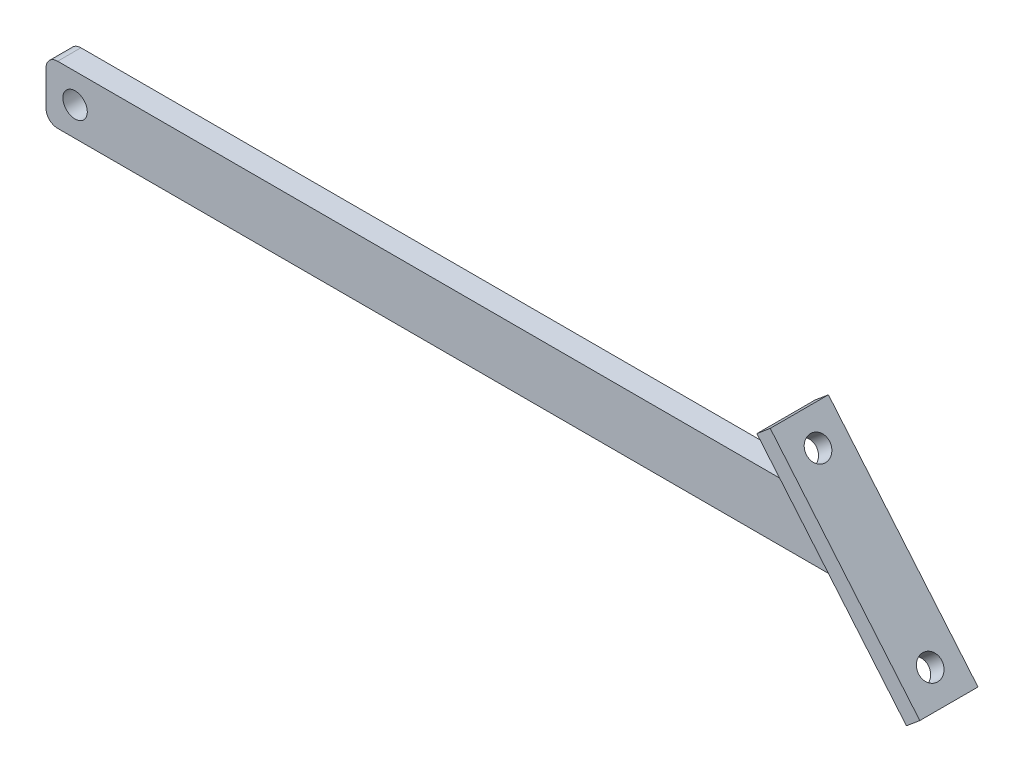
ISO-10303-21;
HEADER;
FILE_DESCRIPTION(('STEP AP214'),'2;1');
FILE_NAME('part.step','',(''),(''),'','','');
FILE_SCHEMA(('AUTOMOTIVE_DESIGN { 1 0 10303 214 1 1 1 1 }'));
ENDSEC;
DATA;
#1=APPLICATION_CONTEXT('core data for automotive mechanical design processes');
#2=APPLICATION_PROTOCOL_DEFINITION('international standard','automotive_design',2000,#1);
#3=PRODUCT_CONTEXT('',#1,'mechanical');
#4=PRODUCT('Part','Part','',(#3));
#5=PRODUCT_RELATED_PRODUCT_CATEGORY('part','',(#4));
#6=PRODUCT_DEFINITION_FORMATION('','',#4);
#7=PRODUCT_DEFINITION_CONTEXT('part definition',#1,'design');
#8=PRODUCT_DEFINITION('design','',#6,#7);
#9=PRODUCT_DEFINITION_SHAPE('','',#8);
#10=(LENGTH_UNIT() NAMED_UNIT(*) SI_UNIT(.MILLI.,.METRE.));
#11=(NAMED_UNIT(*) PLANE_ANGLE_UNIT() SI_UNIT($,.RADIAN.));
#12=(NAMED_UNIT(*) SI_UNIT($,.STERADIAN.) SOLID_ANGLE_UNIT());
#13=UNCERTAINTY_MEASURE_WITH_UNIT(LENGTH_MEASURE(1.E-05),#10,'distance_accuracy_value','');
#14=(GEOMETRIC_REPRESENTATION_CONTEXT(3) GLOBAL_UNCERTAINTY_ASSIGNED_CONTEXT((#13)) GLOBAL_UNIT_ASSIGNED_CONTEXT((#10,
#11,#12)) REPRESENTATION_CONTEXT('',''));
#15=CARTESIAN_POINT('',(0.,0.,0.));
#16=DIRECTION('',(0.,0.,1.));
#17=DIRECTION('',(1.,0.,0.));
#18=AXIS2_PLACEMENT_3D('',#15,#16,#17);
#19=CARTESIAN_POINT('',(73.4224118824471,61.6087187307084,0.));
#20=DIRECTION('',(0.766044443118975,0.642787609686544,0.));
#21=DIRECTION('',(-0.642787609686544,0.766044443118975,0.));
#22=AXIS2_PLACEMENT_3D('',#19,#20,#21);
#23=PLANE('',#22);
#24=CARTESIAN_POINT('',(115.858944825505,11.0348281385772,2.));
#25=DIRECTION('',(0.766044443118974,0.642787609686544,0.));
#26=DIRECTION('',(-0.642787609686544,0.766044443118974,0.));
#27=AXIS2_PLACEMENT_3D('',#24,#25,#26);
#28=CIRCLE('',#27,2.);
#29=CARTESIAN_POINT('',(114.573369606132,12.5669170248151,2.));
#30=VERTEX_POINT('',#29);
#31=EDGE_CURVE('E112',#30,#30,#28,.T.);
#32=ORIENTED_EDGE('',*,*,#31,.F.);
#33=EDGE_LOOP('',(#32));
#34=FACE_BOUND('',#33,.T.);
#35=DIRECTION('',(-0.642787609686544,0.766044443118975,0.));
#36=VECTOR('',#35,1.);
#37=CARTESIAN_POINT('',(112.645006777072,14.865050354172,-3.));
#38=LINE('',#37,#36);
#39=CARTESIAN_POINT('',(138.356511164534,-15.776727370587,-3.));
#40=VERTEX_POINT('',#39);
#41=CARTESIAN_POINT('',(112.645006777072,14.865050354172,-3.));
#42=VERTEX_POINT('',#41);
#43=EDGE_CURVE('E97',#40,#42,#38,.T.);
#44=ORIENTED_EDGE('',*,*,#43,.T.);
#45=DIRECTION('',(0.,0.,1.));
#46=VECTOR('',#45,1.);
#47=CARTESIAN_POINT('',(112.645006777072,14.865050354172,7.));
#48=LINE('',#47,#46);
#49=CARTESIAN_POINT('',(112.645006777072,14.865050354172,7.));
#50=VERTEX_POINT('',#49);
#51=EDGE_CURVE('E92',#42,#50,#48,.T.);
#52=ORIENTED_EDGE('',*,*,#51,.T.);
#53=DIRECTION('',(0.642787609686544,-0.766044443118974,0.));
#54=VECTOR('',#53,1.);
#55=CARTESIAN_POINT('',(138.356511164534,-15.776727370587,7.));
#56=LINE('',#55,#54);
#57=CARTESIAN_POINT('',(138.356511164534,-15.776727370587,7.));
#58=VERTEX_POINT('',#57);
#59=EDGE_CURVE('E95',#50,#58,#56,.T.);
#60=ORIENTED_EDGE('',*,*,#59,.T.);
#61=DIRECTION('',(0.,0.,-1.));
#62=VECTOR('',#61,1.);
#63=CARTESIAN_POINT('',(138.356511164534,-15.776727370587,7.));
#64=LINE('',#63,#62);
#65=EDGE_CURVE('E62',#58,#40,#64,.T.);
#66=ORIENTED_EDGE('',*,*,#65,.T.);
#67=EDGE_LOOP('',(#44,#52,#60,#66));
#68=FACE_BOUND('',#67,.T.);
#69=CARTESIAN_POINT('',(135.142573116101,-11.9465051549921,2.00000000000001));
#70=DIRECTION('',(0.766044443118974,0.642787609686544,0.));
#71=DIRECTION('',(-0.642787609686544,0.766044443118974,0.));
#72=AXIS2_PLACEMENT_3D('',#69,#70,#71);
#73=CIRCLE('',#72,2.);
#74=CARTESIAN_POINT('',(133.856997896728,-10.4144162687541,2.00000000000001));
#75=VERTEX_POINT('',#74);
#76=EDGE_CURVE('E127',#75,#75,#73,.T.);
#77=ORIENTED_EDGE('',*,*,#76,.F.);
#78=EDGE_LOOP('',(#77));
#79=FACE_BOUND('',#78,.T.);
#80=ADVANCED_FACE('F45',(#34,#68,#79),#23,.T.);
#81=CARTESIAN_POINT('',(71.1242785530901,59.6803559016487,0.));
#82=DIRECTION('',(0.766044443118975,0.642787609686544,0.));
#83=DIRECTION('',(-0.642787609686544,0.766044443118975,0.));
#84=AXIS2_PLACEMENT_3D('',#81,#82,#83);
#85=PLANE('',#84);
#86=DIRECTION('',(-0.642787609686544,0.766044443118975,0.));
#87=VECTOR('',#86,1.);
#88=CARTESIAN_POINT('',(110.346873447715,12.9366875251124,-3.));
#89=LINE('',#88,#87);
#90=CARTESIAN_POINT('',(136.058377835177,-17.7050901996466,-3.));
#91=VERTEX_POINT('',#90);
#92=CARTESIAN_POINT('',(110.346873447715,12.9366875251124,-3.));
#93=VERTEX_POINT('',#92);
#94=EDGE_CURVE('E109',#91,#93,#89,.T.);
#95=ORIENTED_EDGE('',*,*,#94,.F.);
#96=DIRECTION('',(0.,0.,-1.));
#97=VECTOR('',#96,1.);
#98=CARTESIAN_POINT('',(136.058377835177,-17.7050901996466,7.));
#99=LINE('',#98,#97);
#100=CARTESIAN_POINT('',(136.058377835177,-17.7050901996466,7.));
#101=VERTEX_POINT('',#100);
#102=EDGE_CURVE('E85',#101,#91,#99,.T.);
#103=ORIENTED_EDGE('',*,*,#102,.F.);
#104=DIRECTION('',(0.642787609686544,-0.766044443118974,0.));
#105=VECTOR('',#104,1.);
#106=CARTESIAN_POINT('',(136.058377835177,-17.7050901996466,7.));
#107=LINE('',#106,#105);
#108=CARTESIAN_POINT('',(110.346873447715,12.9366875251124,7.));
#109=VERTEX_POINT('',#108);
#110=EDGE_CURVE('E79',#109,#101,#107,.T.);
#111=ORIENTED_EDGE('',*,*,#110,.F.);
#112=DIRECTION('',(0.,0.,1.));
#113=VECTOR('',#112,1.);
#114=CARTESIAN_POINT('',(110.346873447715,12.9366875251124,7.));
#115=LINE('',#114,#113);
#116=EDGE_CURVE('E101',#93,#109,#115,.T.);
#117=ORIENTED_EDGE('',*,*,#116,.F.);
#118=EDGE_LOOP('',(#95,#103,#111,#117));
#119=FACE_BOUND('',#118,.T.);
#120=CARTESIAN_POINT('',(113.560811496148,9.10646530951752,2.));
#121=DIRECTION('',(0.766044443118974,0.642787609686544,0.));
#122=DIRECTION('',(-0.642787609686544,0.766044443118974,0.));
#123=AXIS2_PLACEMENT_3D('',#120,#121,#122);
#124=CIRCLE('',#123,2.);
#125=CARTESIAN_POINT('',(112.275236276775,10.6385541957555,2.));
#126=VERTEX_POINT('',#125);
#127=EDGE_CURVE('E124',#126,#126,#124,.T.);
#128=ORIENTED_EDGE('',*,*,#127,.T.);
#129=EDGE_LOOP('',(#128));
#130=FACE_BOUND('',#129,.T.);
#131=CARTESIAN_POINT('',(132.844439786744,-13.8748679840517,2.00000000000001));
#132=DIRECTION('',(0.766044443118974,0.642787609686544,0.));
#133=DIRECTION('',(-0.642787609686544,0.766044443118974,0.));
#134=AXIS2_PLACEMENT_3D('',#131,#132,#133);
#135=CIRCLE('',#134,2.);
#136=CARTESIAN_POINT('',(131.558864567371,-12.3427790978138,2.00000000000001));
#137=VERTEX_POINT('',#136);
#138=EDGE_CURVE('E130',#137,#137,#135,.T.);
#139=ORIENTED_EDGE('',*,*,#138,.T.);
#140=EDGE_LOOP('',(#139));
#141=FACE_BOUND('',#140,.T.);
#142=ADVANCED_FACE('F120',(#119,#130,#141),#85,.F.);
#143=CARTESIAN_POINT('',(112.645006777072,14.865050354172,-3.));
#144=DIRECTION('',(0.,0.,1.));
#145=DIRECTION('',(0.,-1.,0.));
#146=AXIS2_PLACEMENT_3D('',#143,#144,#145);
#147=PLANE('',#146);
#148=ORIENTED_EDGE('',*,*,#94,.T.);
#149=DIRECTION('',(-0.766044443118974,-0.642787609686544,0.));
#150=VECTOR('',#149,1.);
#151=CARTESIAN_POINT('',(112.645006777072,14.865050354172,-3.));
#152=LINE('',#151,#150);
#153=EDGE_CURVE('E12',#42,#93,#152,.T.);
#154=ORIENTED_EDGE('',*,*,#153,.F.);
#155=ORIENTED_EDGE('',*,*,#43,.F.);
#156=DIRECTION('',(-0.766044443118974,-0.642787609686544,0.));
#157=VECTOR('',#156,1.);
#158=CARTESIAN_POINT('',(138.356511164534,-15.776727370587,-3.));
#159=LINE('',#158,#157);
#160=EDGE_CURVE('E105',#40,#91,#159,.T.);
#161=ORIENTED_EDGE('',*,*,#160,.T.);
#162=EDGE_LOOP('',(#148,#154,#155,#161));
#163=FACE_BOUND('',#162,.T.);
#164=ADVANCED_FACE('F47',(#163),#147,.F.);
#165=CARTESIAN_POINT('',(112.645006777072,14.865050354172,7.));
#166=DIRECTION('',(0.642787609686544,-0.766044443118974,0.));
#167=DIRECTION('',(0.766044443118975,0.642787609686544,0.));
#168=AXIS2_PLACEMENT_3D('',#165,#166,#167);
#169=PLANE('',#168);
#170=ORIENTED_EDGE('',*,*,#116,.T.);
#171=DIRECTION('',(-0.766044443118974,-0.642787609686544,0.));
#172=VECTOR('',#171,1.);
#173=CARTESIAN_POINT('',(112.645006777072,14.865050354172,7.));
#174=LINE('',#173,#172);
#175=EDGE_CURVE('E54',#50,#109,#174,.T.);
#176=ORIENTED_EDGE('',*,*,#175,.F.);
#177=ORIENTED_EDGE('',*,*,#51,.F.);
#178=ORIENTED_EDGE('',*,*,#153,.T.);
#179=EDGE_LOOP('',(#170,#176,#177,#178));
#180=FACE_BOUND('',#179,.T.);
#181=ADVANCED_FACE('F100',(#180),#169,.F.);
#182=CARTESIAN_POINT('',(138.356511164534,-15.776727370587,7.));
#183=DIRECTION('',(0.,0.,-1.));
#184=DIRECTION('',(-1.,0.,0.));
#185=AXIS2_PLACEMENT_3D('',#182,#183,#184);
#186=PLANE('',#185);
#187=ORIENTED_EDGE('',*,*,#110,.T.);
#188=DIRECTION('',(-0.766044443118974,-0.642787609686544,0.));
#189=VECTOR('',#188,1.);
#190=CARTESIAN_POINT('',(138.356511164534,-15.776727370587,7.));
#191=LINE('',#190,#189);
#192=EDGE_CURVE('E102',#58,#101,#191,.T.);
#193=ORIENTED_EDGE('',*,*,#192,.F.);
#194=ORIENTED_EDGE('',*,*,#59,.F.);
#195=ORIENTED_EDGE('',*,*,#175,.T.);
#196=EDGE_LOOP('',(#187,#193,#194,#195));
#197=FACE_BOUND('',#196,.T.);
#198=ADVANCED_FACE('F103',(#197),#186,.F.);
#199=CARTESIAN_POINT('',(138.356511164534,-15.776727370587,7.));
#200=DIRECTION('',(-0.642787609686544,0.766044443118974,0.));
#201=DIRECTION('',(-0.766044443118975,-0.642787609686544,0.));
#202=AXIS2_PLACEMENT_3D('',#199,#200,#201);
#203=PLANE('',#202);
#204=ORIENTED_EDGE('',*,*,#102,.T.);
#205=ORIENTED_EDGE('',*,*,#160,.F.);
#206=ORIENTED_EDGE('',*,*,#65,.F.);
#207=ORIENTED_EDGE('',*,*,#192,.T.);
#208=EDGE_LOOP('',(#204,#205,#206,#207));
#209=FACE_BOUND('',#208,.T.);
#210=ADVANCED_FACE('F117',(#209),#203,.F.);
#211=CARTESIAN_POINT('',(115.858944825505,11.0348281385772,2.));
#212=DIRECTION('',(-0.766044443118974,-0.642787609686544,0.));
#213=DIRECTION('',(0.642787609686544,-0.766044443118975,0.));
#214=AXIS2_PLACEMENT_3D('',#211,#212,#213);
#215=CYLINDRICAL_SURFACE('',#214,2.);
#216=ORIENTED_EDGE('',*,*,#31,.T.);
#217=EDGE_LOOP('',(#216));
#218=FACE_BOUND('',#217,.T.);
#219=ORIENTED_EDGE('',*,*,#127,.F.);
#220=EDGE_LOOP('',(#219));
#221=FACE_BOUND('',#220,.T.);
#222=ADVANCED_FACE('F147',(#218,#221),#215,.F.);
#223=CARTESIAN_POINT('',(135.142573116101,-11.9465051549921,2.00000000000001));
#224=DIRECTION('',(-0.766044443118974,-0.642787609686544,0.));
#225=DIRECTION('',(0.642787609686544,-0.766044443118975,0.));
#226=AXIS2_PLACEMENT_3D('',#223,#224,#225);
#227=CYLINDRICAL_SURFACE('',#226,2.);
#228=ORIENTED_EDGE('',*,*,#76,.T.);
#229=EDGE_LOOP('',(#228));
#230=FACE_BOUND('',#229,.T.);
#231=ORIENTED_EDGE('',*,*,#138,.F.);
#232=EDGE_LOOP('',(#231));
#233=FACE_BOUND('',#232,.T.);
#234=ADVANCED_FACE('F136',(#230,#233),#227,.F.);
#235=CLOSED_SHELL('',(#80,#142,#164,#181,#198,#210,#222,#234));
#236=MANIFOLD_SOLID_BREP('B2',#235);
#237=CARTESIAN_POINT('',(0.,0.,4.));
#238=DIRECTION('',(0.,0.,1.));
#239=DIRECTION('',(1.,0.,0.));
#240=AXIS2_PLACEMENT_3D('',#237,#238,#239);
#241=PLANE('',#240);
#242=DIRECTION('',(0.,-1.,0.));
#243=VECTOR('',#242,1.);
#244=CARTESIAN_POINT('',(-14.8342541436464,5.27624309392265,4.));
#245=LINE('',#244,#243);
#246=CARTESIAN_POINT('',(-14.8342541436464,3.27624309392265,4.));
#247=VERTEX_POINT('',#246);
#248=CARTESIAN_POINT('',(-14.8342541436464,-2.72375690607735,4.));
#249=VERTEX_POINT('',#248);
#250=EDGE_CURVE('E275',#247,#249,#245,.T.);
#251=ORIENTED_EDGE('',*,*,#250,.T.);
#252=CARTESIAN_POINT('',(-12.8342541436464,-2.72375690607735,4.));
#253=DIRECTION('',(0.,0.,1.));
#254=DIRECTION('',(1.,0.,0.));
#255=AXIS2_PLACEMENT_3D('',#252,#253,#254);
#256=CIRCLE('',#255,2.);
#257=CARTESIAN_POINT('',(-12.8342541436464,-4.72375690607735,4.));
#258=VERTEX_POINT('',#257);
#259=EDGE_CURVE('E219',#249,#258,#256,.T.);
#260=ORIENTED_EDGE('',*,*,#259,.T.);
#261=DIRECTION('',(1.,0.,0.));
#262=VECTOR('',#261,1.);
#263=CARTESIAN_POINT('',(-14.8342541436464,-4.72375690607735,4.));
#264=LINE('',#263,#262);
#265=CARTESIAN_POINT('',(125.165745856354,-4.72375690607735,4.));
#266=VERTEX_POINT('',#265);
#267=EDGE_CURVE('E265',#258,#266,#264,.T.);
#268=ORIENTED_EDGE('',*,*,#267,.T.);
#269=DIRECTION('',(-0.642787609686544,0.766044443118974,0.));
#270=VECTOR('',#269,1.);
#271=CARTESIAN_POINT('',(125.165745856354,-4.72375690607735,4.));
#272=LINE('',#271,#270);
#273=CARTESIAN_POINT('',(116.774749544581,5.27624309392265,4.));
#274=VERTEX_POINT('',#273);
#275=EDGE_CURVE('E269',#266,#274,#272,.T.);
#276=ORIENTED_EDGE('',*,*,#275,.T.);
#277=DIRECTION('',(-1.,0.,0.));
#278=VECTOR('',#277,1.);
#279=CARTESIAN_POINT('',(-14.8342541436464,5.27624309392265,4.));
#280=LINE('',#279,#278);
#281=CARTESIAN_POINT('',(-12.8342541436464,5.27624309392265,4.));
#282=VERTEX_POINT('',#281);
#283=EDGE_CURVE('E289',#274,#282,#280,.T.);
#284=ORIENTED_EDGE('',*,*,#283,.T.);
#285=CARTESIAN_POINT('',(-12.8342541436464,3.27624309392265,4.));
#286=DIRECTION('',(0.,0.,1.));
#287=DIRECTION('',(1.,0.,0.));
#288=AXIS2_PLACEMENT_3D('',#285,#286,#287);
#289=CIRCLE('',#288,2.);
#290=EDGE_CURVE('E312',#282,#247,#289,.T.);
#291=ORIENTED_EDGE('',*,*,#290,.T.);
#292=EDGE_LOOP('',(#251,#260,#268,#276,#284,#291));
#293=FACE_BOUND('',#292,.T.);
#294=CARTESIAN_POINT('',(-9.8342541436464,0.276243093922653,4.));
#295=DIRECTION('',(0.,0.,1.));
#296=DIRECTION('',(1.,0.,0.));
#297=AXIS2_PLACEMENT_3D('',#294,#295,#296);
#298=CIRCLE('',#297,2.1);
#299=CARTESIAN_POINT('',(-7.7342541436464,0.276243093922653,4.));
#300=VERTEX_POINT('',#299);
#301=EDGE_CURVE('E296',#300,#300,#298,.T.);
#302=ORIENTED_EDGE('',*,*,#301,.F.);
#303=EDGE_LOOP('',(#302));
#304=FACE_BOUND('',#303,.T.);
#305=ADVANCED_FACE('F211',(#293,#304),#241,.T.);
#306=CARTESIAN_POINT('',(0.,0.,0.));
#307=DIRECTION('',(0.,0.,1.));
#308=DIRECTION('',(1.,0.,0.));
#309=AXIS2_PLACEMENT_3D('',#306,#307,#308);
#310=PLANE('',#309);
#311=DIRECTION('',(1.,0.,0.));
#312=VECTOR('',#311,1.);
#313=CARTESIAN_POINT('',(-14.8342541436464,-4.72375690607735,0.));
#314=LINE('',#313,#312);
#315=CARTESIAN_POINT('',(-12.8342541436464,-4.72375690607735,0.));
#316=VERTEX_POINT('',#315);
#317=CARTESIAN_POINT('',(125.165745856354,-4.72375690607735,0.));
#318=VERTEX_POINT('',#317);
#319=EDGE_CURVE('E281',#316,#318,#314,.T.);
#320=ORIENTED_EDGE('',*,*,#319,.F.);
#321=CARTESIAN_POINT('',(-12.8342541436464,-2.72375690607735,0.));
#322=DIRECTION('',(0.,0.,1.));
#323=DIRECTION('',(1.,0.,0.));
#324=AXIS2_PLACEMENT_3D('',#321,#322,#323);
#325=CIRCLE('',#324,2.);
#326=CARTESIAN_POINT('',(-14.8342541436464,-2.72375690607735,0.));
#327=VERTEX_POINT('',#326);
#328=EDGE_CURVE('E306',#316,#327,#325,.F.);
#329=ORIENTED_EDGE('',*,*,#328,.T.);
#330=DIRECTION('',(0.,-1.,0.));
#331=VECTOR('',#330,1.);
#332=CARTESIAN_POINT('',(-14.8342541436464,5.27624309392265,0.));
#333=LINE('',#332,#331);
#334=CARTESIAN_POINT('',(-14.8342541436464,3.27624309392265,0.));
#335=VERTEX_POINT('',#334);
#336=EDGE_CURVE('E294',#335,#327,#333,.T.);
#337=ORIENTED_EDGE('',*,*,#336,.F.);
#338=CARTESIAN_POINT('',(-12.8342541436464,3.27624309392265,0.));
#339=DIRECTION('',(0.,0.,1.));
#340=DIRECTION('',(1.,0.,0.));
#341=AXIS2_PLACEMENT_3D('',#338,#339,#340);
#342=CIRCLE('',#341,2.);
#343=CARTESIAN_POINT('',(-12.8342541436464,5.27624309392265,0.));
#344=VERTEX_POINT('',#343);
#345=EDGE_CURVE('E304',#335,#344,#342,.F.);
#346=ORIENTED_EDGE('',*,*,#345,.T.);
#347=DIRECTION('',(-1.,0.,0.));
#348=VECTOR('',#347,1.);
#349=CARTESIAN_POINT('',(-14.8342541436464,5.27624309392265,0.));
#350=LINE('',#349,#348);
#351=CARTESIAN_POINT('',(116.774749544581,5.27624309392265,0.));
#352=VERTEX_POINT('',#351);
#353=EDGE_CURVE('E300',#352,#344,#350,.T.);
#354=ORIENTED_EDGE('',*,*,#353,.F.);
#355=DIRECTION('',(-0.642787609686544,0.766044443118974,0.));
#356=VECTOR('',#355,1.);
#357=CARTESIAN_POINT('',(125.165745856354,-4.72375690607735,0.));
#358=LINE('',#357,#356);
#359=EDGE_CURVE('E298',#318,#352,#358,.T.);
#360=ORIENTED_EDGE('',*,*,#359,.F.);
#361=EDGE_LOOP('',(#320,#329,#337,#346,#354,#360));
#362=FACE_BOUND('',#361,.T.);
#363=CARTESIAN_POINT('',(-9.8342541436464,0.276243093922653,0.));
#364=DIRECTION('',(0.,0.,1.));
#365=DIRECTION('',(1.,0.,0.));
#366=AXIS2_PLACEMENT_3D('',#363,#364,#365);
#367=CIRCLE('',#366,2.1);
#368=CARTESIAN_POINT('',(-7.7342541436464,0.276243093922653,0.));
#369=VERTEX_POINT('',#368);
#370=EDGE_CURVE('E402',#369,#369,#367,.T.);
#371=ORIENTED_EDGE('',*,*,#370,.T.);
#372=EDGE_LOOP('',(#371));
#373=FACE_BOUND('',#372,.T.);
#374=ADVANCED_FACE('F320',(#362,#373),#310,.F.);
#375=CARTESIAN_POINT('',(-14.8342541436464,5.27624309392265,4.));
#376=DIRECTION('',(1.,0.,0.));
#377=DIRECTION('',(0.,0.,-1.));
#378=AXIS2_PLACEMENT_3D('',#375,#376,#377);
#379=PLANE('',#378);
#380=ORIENTED_EDGE('',*,*,#336,.T.);
#381=DIRECTION('',(0.,0.,-1.));
#382=VECTOR('',#381,1.);
#383=CARTESIAN_POINT('',(-14.8342541436464,-2.72375690607735,4.));
#384=LINE('',#383,#382);
#385=EDGE_CURVE('E232',#327,#249,#384,.F.);
#386=ORIENTED_EDGE('',*,*,#385,.T.);
#387=ORIENTED_EDGE('',*,*,#250,.F.);
#388=DIRECTION('',(0.,0.,-1.));
#389=VECTOR('',#388,1.);
#390=CARTESIAN_POINT('',(-14.8342541436464,3.27624309392265,4.));
#391=LINE('',#390,#389);
#392=EDGE_CURVE('E308',#247,#335,#391,.T.);
#393=ORIENTED_EDGE('',*,*,#392,.T.);
#394=EDGE_LOOP('',(#380,#386,#387,#393));
#395=FACE_BOUND('',#394,.T.);
#396=ADVANCED_FACE('F316',(#395),#379,.F.);
#397=CARTESIAN_POINT('',(-14.8342541436464,-4.72375690607735,4.));
#398=DIRECTION('',(0.,1.,0.));
#399=DIRECTION('',(-1.,0.,0.));
#400=AXIS2_PLACEMENT_3D('',#397,#398,#399);
#401=PLANE('',#400);
#402=ORIENTED_EDGE('',*,*,#267,.F.);
#403=DIRECTION('',(0.,0.,-1.));
#404=VECTOR('',#403,1.);
#405=CARTESIAN_POINT('',(-12.8342541436464,-4.72375690607735,4.));
#406=LINE('',#405,#404);
#407=EDGE_CURVE('E284',#258,#316,#406,.T.);
#408=ORIENTED_EDGE('',*,*,#407,.T.);
#409=ORIENTED_EDGE('',*,*,#319,.T.);
#410=DIRECTION('',(0.,0.,-1.));
#411=VECTOR('',#410,1.);
#412=CARTESIAN_POINT('',(125.165745856354,-4.72375690607735,4.));
#413=LINE('',#412,#411);
#414=EDGE_CURVE('E278',#266,#318,#413,.T.);
#415=ORIENTED_EDGE('',*,*,#414,.F.);
#416=EDGE_LOOP('',(#402,#408,#409,#415));
#417=FACE_BOUND('',#416,.T.);
#418=ADVANCED_FACE('F279',(#417),#401,.F.);
#419=CARTESIAN_POINT('',(125.165745856354,-4.72375690607735,4.));
#420=DIRECTION('',(-0.766044443118974,-0.642787609686544,0.));
#421=DIRECTION('',(0.642787609686544,-0.766044443118974,0.));
#422=AXIS2_PLACEMENT_3D('',#419,#420,#421);
#423=PLANE('',#422);
#424=ORIENTED_EDGE('',*,*,#359,.T.);
#425=DIRECTION('',(0.,0.,-1.));
#426=VECTOR('',#425,1.);
#427=CARTESIAN_POINT('',(116.774749544581,5.27624309392265,4.));
#428=LINE('',#427,#426);
#429=EDGE_CURVE('E285',#274,#352,#428,.T.);
#430=ORIENTED_EDGE('',*,*,#429,.F.);
#431=ORIENTED_EDGE('',*,*,#275,.F.);
#432=ORIENTED_EDGE('',*,*,#414,.T.);
#433=EDGE_LOOP('',(#424,#430,#431,#432));
#434=FACE_BOUND('',#433,.T.);
#435=ADVANCED_FACE('F287',(#434),#423,.F.);
#436=CARTESIAN_POINT('',(-14.8342541436464,5.27624309392265,4.));
#437=DIRECTION('',(0.,-1.,0.));
#438=DIRECTION('',(0.,0.,-1.));
#439=AXIS2_PLACEMENT_3D('',#436,#437,#438);
#440=PLANE('',#439);
#441=ORIENTED_EDGE('',*,*,#353,.T.);
#442=DIRECTION('',(0.,0.,-1.));
#443=VECTOR('',#442,1.);
#444=CARTESIAN_POINT('',(-12.8342541436464,5.27624309392265,4.));
#445=LINE('',#444,#443);
#446=EDGE_CURVE('E43',#344,#282,#445,.F.);
#447=ORIENTED_EDGE('',*,*,#446,.T.);
#448=ORIENTED_EDGE('',*,*,#283,.F.);
#449=ORIENTED_EDGE('',*,*,#429,.T.);
#450=EDGE_LOOP('',(#441,#447,#448,#449));
#451=FACE_BOUND('',#450,.T.);
#452=ADVANCED_FACE('F322',(#451),#440,.F.);
#453=CARTESIAN_POINT('',(-9.8342541436464,0.276243093922653,4.));
#454=DIRECTION('',(0.,0.,-1.));
#455=DIRECTION('',(-1.,0.,0.));
#456=AXIS2_PLACEMENT_3D('',#453,#454,#455);
#457=CYLINDRICAL_SURFACE('',#456,2.1);
#458=ORIENTED_EDGE('',*,*,#301,.T.);
#459=EDGE_LOOP('',(#458));
#460=FACE_BOUND('',#459,.T.);
#461=ORIENTED_EDGE('',*,*,#370,.F.);
#462=EDGE_LOOP('',(#461));
#463=FACE_BOUND('',#462,.T.);
#464=ADVANCED_FACE('F324',(#460,#463),#457,.F.);
#465=CARTESIAN_POINT('',(-12.8342541436464,-2.72375690607735,4.));
#466=DIRECTION('',(0.,0.,-1.));
#467=DIRECTION('',(-1.,0.,0.));
#468=AXIS2_PLACEMENT_3D('',#465,#466,#467);
#469=CYLINDRICAL_SURFACE('',#468,2.);
#470=ORIENTED_EDGE('',*,*,#259,.F.);
#471=ORIENTED_EDGE('',*,*,#385,.F.);
#472=ORIENTED_EDGE('',*,*,#328,.F.);
#473=ORIENTED_EDGE('',*,*,#407,.F.);
#474=EDGE_LOOP('',(#470,#471,#472,#473));
#475=FACE_BOUND('',#474,.T.);
#476=ADVANCED_FACE('F330',(#475),#469,.T.);
#477=CARTESIAN_POINT('',(-12.8342541436464,3.27624309392265,4.));
#478=DIRECTION('',(0.,0.,-1.));
#479=DIRECTION('',(-1.,0.,0.));
#480=AXIS2_PLACEMENT_3D('',#477,#478,#479);
#481=CYLINDRICAL_SURFACE('',#480,2.);
#482=ORIENTED_EDGE('',*,*,#290,.F.);
#483=ORIENTED_EDGE('',*,*,#446,.F.);
#484=ORIENTED_EDGE('',*,*,#345,.F.);
#485=ORIENTED_EDGE('',*,*,#392,.F.);
#486=EDGE_LOOP('',(#482,#483,#484,#485));
#487=FACE_BOUND('',#486,.T.);
#488=ADVANCED_FACE('F213',(#487),#481,.T.);
#489=CLOSED_SHELL('',(#305,#374,#396,#418,#435,#452,#464,#476,#488));
#490=MANIFOLD_SOLID_BREP('B6',#489);
#491=ADVANCED_BREP_SHAPE_REPRESENTATION('',(#18,#236,#490),#14);
#492=SHAPE_DEFINITION_REPRESENTATION(#9,#491);
ENDSEC;
END-ISO-10303-21;
